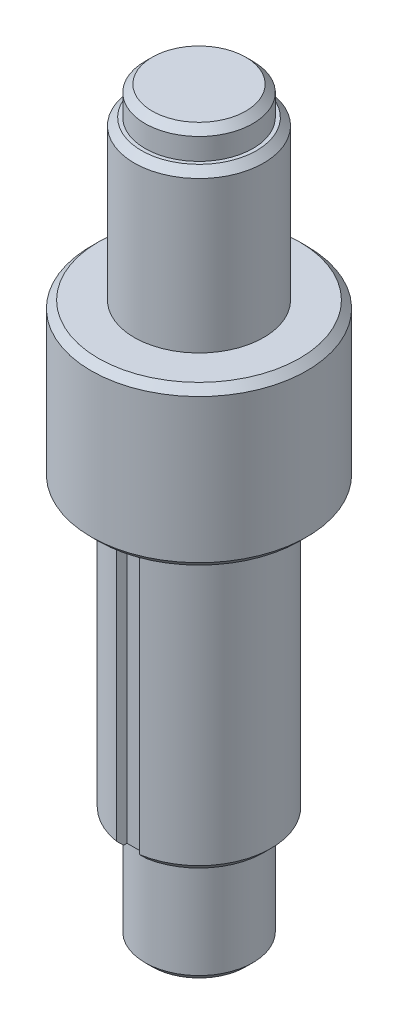
ISO-10303-21;
HEADER;
FILE_DESCRIPTION(('STEP AP214'),'2;1');
FILE_NAME('part.step','',(''),(''),'','','');
FILE_SCHEMA(('AUTOMOTIVE_DESIGN { 1 0 10303 214 1 1 1 1 }'));
ENDSEC;
DATA;
#1=APPLICATION_CONTEXT('core data for automotive mechanical design processes');
#2=APPLICATION_PROTOCOL_DEFINITION('international standard','automotive_design',2000,#1);
#3=PRODUCT_CONTEXT('',#1,'mechanical');
#4=PRODUCT('Part','Part','',(#3));
#5=PRODUCT_RELATED_PRODUCT_CATEGORY('part','',(#4));
#6=PRODUCT_DEFINITION_FORMATION('','',#4);
#7=PRODUCT_DEFINITION_CONTEXT('part definition',#1,'design');
#8=PRODUCT_DEFINITION('design','',#6,#7);
#9=PRODUCT_DEFINITION_SHAPE('','',#8);
#10=(LENGTH_UNIT() NAMED_UNIT(*) SI_UNIT(.MILLI.,.METRE.));
#11=(NAMED_UNIT(*) PLANE_ANGLE_UNIT() SI_UNIT($,.RADIAN.));
#12=(NAMED_UNIT(*) SI_UNIT($,.STERADIAN.) SOLID_ANGLE_UNIT());
#13=UNCERTAINTY_MEASURE_WITH_UNIT(LENGTH_MEASURE(1.E-05),#10,'distance_accuracy_value','');
#14=(GEOMETRIC_REPRESENTATION_CONTEXT(3) GLOBAL_UNCERTAINTY_ASSIGNED_CONTEXT((#13)) GLOBAL_UNIT_ASSIGNED_CONTEXT((#10,
#11,#12)) REPRESENTATION_CONTEXT('',''));
#15=CARTESIAN_POINT('',(0.,0.,0.));
#16=DIRECTION('',(0.,0.,1.));
#17=DIRECTION('',(1.,0.,0.));
#18=AXIS2_PLACEMENT_3D('',#15,#16,#17);
#19=CARTESIAN_POINT('',(0.,0.,0.));
#20=DIRECTION('',(0.,1.,0.));
#21=DIRECTION('',(0.,0.,1.));
#22=AXIS2_PLACEMENT_3D('',#19,#20,#21);
#23=PLANE('',#22);
#24=CARTESIAN_POINT('',(0.,0.,0.));
#25=DIRECTION('',(0.,1.,0.));
#26=DIRECTION('',(0.,0.,1.));
#27=AXIS2_PLACEMENT_3D('',#24,#25,#26);
#28=CIRCLE('',#27,6.49999999999999);
#29=CARTESIAN_POINT('',(0.,0.,6.49999999999999));
#30=VERTEX_POINT('',#29);
#31=EDGE_CURVE('E211',#30,#30,#28,.F.);
#32=ORIENTED_EDGE('',*,*,#31,.T.);
#33=EDGE_LOOP('',(#32));
#34=FACE_BOUND('',#33,.T.);
#35=ADVANCED_FACE('F33',(#34),#23,.F.);
#36=CARTESIAN_POINT('',(0.,103.,0.));
#37=DIRECTION('',(0.,1.,0.));
#38=DIRECTION('',(0.,0.,1.));
#39=AXIS2_PLACEMENT_3D('',#36,#37,#38);
#40=CYLINDRICAL_SURFACE('',#39,7.5);
#41=CARTESIAN_POINT('',(0.,1.00000000000001,0.));
#42=DIRECTION('',(0.,1.,0.));
#43=DIRECTION('',(0.,0.,1.));
#44=AXIS2_PLACEMENT_3D('',#41,#42,#43);
#45=CIRCLE('',#44,7.5);
#46=CARTESIAN_POINT('',(0.,1.00000000000001,7.5));
#47=VERTEX_POINT('',#46);
#48=EDGE_CURVE('E208',#47,#47,#45,.T.);
#49=ORIENTED_EDGE('',*,*,#48,.T.);
#50=EDGE_LOOP('',(#49));
#51=FACE_BOUND('',#50,.T.);
#52=CARTESIAN_POINT('',(0.,15.,0.));
#53=DIRECTION('',(0.,1.,0.));
#54=DIRECTION('',(0.,0.,1.));
#55=AXIS2_PLACEMENT_3D('',#52,#53,#54);
#56=CIRCLE('',#55,7.5);
#57=CARTESIAN_POINT('',(0.,15.,7.5));
#58=VERTEX_POINT('',#57);
#59=EDGE_CURVE('E199',#58,#58,#56,.T.);
#60=ORIENTED_EDGE('',*,*,#59,.F.);
#61=EDGE_LOOP('',(#60));
#62=FACE_BOUND('',#61,.T.);
#63=ADVANCED_FACE('F282',(#51,#62),#40,.T.);
#64=CARTESIAN_POINT('',(7.5,15.,0.));
#65=DIRECTION('',(0.,1.,0.));
#66=DIRECTION('',(0.,0.,1.));
#67=AXIS2_PLACEMENT_3D('',#64,#65,#66);
#68=PLANE('',#67);
#69=DIRECTION('',(0.,0.,-1.));
#70=VECTOR('',#69,1.);
#71=CARTESIAN_POINT('',(-1.625,15.,11.625));
#72=LINE('',#71,#70);
#73=CARTESIAN_POINT('',(-1.625,15.,8.85208308817759));
#74=VERTEX_POINT('',#73);
#75=CARTESIAN_POINT('',(-1.625,15.,8.375));
#76=VERTEX_POINT('',#75);
#77=EDGE_CURVE('E169',#74,#76,#72,.T.);
#78=ORIENTED_EDGE('',*,*,#77,.F.);
#79=CARTESIAN_POINT('',(0.,15.,0.));
#80=DIRECTION('',(0.,1.,0.));
#81=DIRECTION('',(0.,0.,1.));
#82=AXIS2_PLACEMENT_3D('',#79,#80,#81);
#83=CIRCLE('',#82,8.99999999999998);
#84=CARTESIAN_POINT('',(1.625,15.,8.85208308817759));
#85=VERTEX_POINT('',#84);
#86=EDGE_CURVE('E61',#74,#85,#83,.F.);
#87=ORIENTED_EDGE('',*,*,#86,.T.);
#88=DIRECTION('',(0.,0.,1.));
#89=VECTOR('',#88,1.);
#90=CARTESIAN_POINT('',(1.625,15.,11.625));
#91=LINE('',#90,#89);
#92=CARTESIAN_POINT('',(1.625,15.,8.375));
#93=VERTEX_POINT('',#92);
#94=EDGE_CURVE('E164',#93,#85,#91,.T.);
#95=ORIENTED_EDGE('',*,*,#94,.F.);
#96=DIRECTION('',(1.,0.,0.));
#97=VECTOR('',#96,1.);
#98=CARTESIAN_POINT('',(-1.625,15.,8.375));
#99=LINE('',#98,#97);
#100=EDGE_CURVE('E165',#76,#93,#99,.T.);
#101=ORIENTED_EDGE('',*,*,#100,.F.);
#102=EDGE_LOOP('',(#78,#87,#95,#101));
#103=FACE_BOUND('',#102,.T.);
#104=ORIENTED_EDGE('',*,*,#59,.T.);
#105=EDGE_LOOP('',(#104));
#106=FACE_BOUND('',#105,.T.);
#107=ADVANCED_FACE('F278',(#103,#106),#68,.F.);
#108=CARTESIAN_POINT('',(0.,103.,0.));
#109=DIRECTION('',(0.,1.,0.));
#110=DIRECTION('',(0.,0.,1.));
#111=AXIS2_PLACEMENT_3D('',#108,#109,#110);
#112=CYLINDRICAL_SURFACE('',#111,10.);
#113=DIRECTION('',(0.,1.,0.));
#114=VECTOR('',#113,1.);
#115=CARTESIAN_POINT('',(1.625,103.,9.86708543593294));
#116=LINE('',#115,#114);
#117=CARTESIAN_POINT('',(1.625,55.,9.86708543593294));
#118=VERTEX_POINT('',#117);
#119=CARTESIAN_POINT('',(1.625,16.,9.86708543593294));
#120=VERTEX_POINT('',#119);
#121=EDGE_CURVE('E175',#118,#120,#116,.F.);
#122=ORIENTED_EDGE('',*,*,#121,.T.);
#123=CARTESIAN_POINT('',(0.,16.,0.));
#124=DIRECTION('',(0.,1.,0.));
#125=DIRECTION('',(0.,0.,1.));
#126=AXIS2_PLACEMENT_3D('',#123,#124,#125);
#127=CIRCLE('',#126,10.);
#128=CARTESIAN_POINT('',(-1.625,16.,9.86708543593294));
#129=VERTEX_POINT('',#128);
#130=EDGE_CURVE('E230',#120,#129,#127,.T.);
#131=ORIENTED_EDGE('',*,*,#130,.T.);
#132=DIRECTION('',(0.,1.,0.));
#133=VECTOR('',#132,1.);
#134=CARTESIAN_POINT('',(-1.625,103.,9.86708543593294));
#135=LINE('',#134,#133);
#136=CARTESIAN_POINT('',(-1.625,55.,9.86708543593294));
#137=VERTEX_POINT('',#136);
#138=EDGE_CURVE('E187',#129,#137,#135,.T.);
#139=ORIENTED_EDGE('',*,*,#138,.T.);
#140=CARTESIAN_POINT('',(0.,55.,0.));
#141=DIRECTION('',(0.,1.,0.));
#142=DIRECTION('',(0.,0.,1.));
#143=AXIS2_PLACEMENT_3D('',#140,#141,#142);
#144=CIRCLE('',#143,10.);
#145=EDGE_CURVE('E196',#118,#137,#144,.T.);
#146=ORIENTED_EDGE('',*,*,#145,.F.);
#147=EDGE_LOOP('',(#122,#131,#139,#146));
#148=FACE_BOUND('',#147,.T.);
#149=ADVANCED_FACE('F274',(#148),#112,.T.);
#150=CARTESIAN_POINT('',(10.,55.,0.));
#151=DIRECTION('',(0.,1.,0.));
#152=DIRECTION('',(0.,0.,1.));
#153=AXIS2_PLACEMENT_3D('',#150,#151,#152);
#154=PLANE('',#153);
#155=CARTESIAN_POINT('',(0.,55.,0.));
#156=DIRECTION('',(0.,1.,0.));
#157=DIRECTION('',(0.,0.,1.));
#158=AXIS2_PLACEMENT_3D('',#155,#156,#157);
#159=CIRCLE('',#158,14.);
#160=CARTESIAN_POINT('',(0.,55.,14.));
#161=VERTEX_POINT('',#160);
#162=EDGE_CURVE('E223',#161,#161,#159,.F.);
#163=ORIENTED_EDGE('',*,*,#162,.T.);
#164=EDGE_LOOP('',(#163));
#165=FACE_BOUND('',#164,.T.);
#166=ORIENTED_EDGE('',*,*,#145,.T.);
#167=DIRECTION('',(0.,0.,-1.));
#168=VECTOR('',#167,1.);
#169=CARTESIAN_POINT('',(-1.625,55.,11.625));
#170=LINE('',#169,#168);
#171=CARTESIAN_POINT('',(-1.625,55.,8.375));
#172=VERTEX_POINT('',#171);
#173=EDGE_CURVE('E168',#137,#172,#170,.T.);
#174=ORIENTED_EDGE('',*,*,#173,.T.);
#175=DIRECTION('',(1.,0.,0.));
#176=VECTOR('',#175,1.);
#177=CARTESIAN_POINT('',(-1.625,55.,8.375));
#178=LINE('',#177,#176);
#179=CARTESIAN_POINT('',(1.625,55.,8.375));
#180=VERTEX_POINT('',#179);
#181=EDGE_CURVE('E177',#172,#180,#178,.T.);
#182=ORIENTED_EDGE('',*,*,#181,.T.);
#183=DIRECTION('',(0.,0.,1.));
#184=VECTOR('',#183,1.);
#185=CARTESIAN_POINT('',(1.625,55.,11.625));
#186=LINE('',#185,#184);
#187=EDGE_CURVE('E172',#180,#118,#186,.T.);
#188=ORIENTED_EDGE('',*,*,#187,.T.);
#189=EDGE_LOOP('',(#166,#174,#182,#188));
#190=FACE_BOUND('',#189,.T.);
#191=ADVANCED_FACE('F270',(#165,#190),#154,.F.);
#192=CARTESIAN_POINT('',(0.,103.,0.));
#193=DIRECTION('',(0.,1.,0.));
#194=DIRECTION('',(0.,0.,1.));
#195=AXIS2_PLACEMENT_3D('',#192,#193,#194);
#196=CYLINDRICAL_SURFACE('',#195,15.);
#197=CARTESIAN_POINT('',(0.,76.,0.));
#198=DIRECTION('',(0.,-1.,0.));
#199=DIRECTION('',(0.,0.,-1.));
#200=AXIS2_PLACEMENT_3D('',#197,#198,#199);
#201=CIRCLE('',#200,15.);
#202=CARTESIAN_POINT('',(0.,76.,-15.));
#203=VERTEX_POINT('',#202);
#204=EDGE_CURVE('E220',#203,#203,#201,.T.);
#205=ORIENTED_EDGE('',*,*,#204,.T.);
#206=EDGE_LOOP('',(#205));
#207=FACE_BOUND('',#206,.T.);
#208=CARTESIAN_POINT('',(0.,56.,0.));
#209=DIRECTION('',(0.,1.,0.));
#210=DIRECTION('',(0.,0.,1.));
#211=AXIS2_PLACEMENT_3D('',#208,#209,#210);
#212=CIRCLE('',#211,15.);
#213=CARTESIAN_POINT('',(0.,56.,15.));
#214=VERTEX_POINT('',#213);
#215=EDGE_CURVE('E217',#214,#214,#212,.T.);
#216=ORIENTED_EDGE('',*,*,#215,.T.);
#217=EDGE_LOOP('',(#216));
#218=FACE_BOUND('',#217,.T.);
#219=ADVANCED_FACE('F266',(#207,#218),#196,.T.);
#220=CARTESIAN_POINT('',(15.,77.,0.));
#221=DIRECTION('',(0.,-1.,0.));
#222=DIRECTION('',(0.,0.,-1.));
#223=AXIS2_PLACEMENT_3D('',#220,#221,#222);
#224=PLANE('',#223);
#225=CARTESIAN_POINT('',(0.,77.,0.));
#226=DIRECTION('',(0.,-1.,0.));
#227=DIRECTION('',(0.,0.,-1.));
#228=AXIS2_PLACEMENT_3D('',#225,#226,#227);
#229=CIRCLE('',#228,14.);
#230=CARTESIAN_POINT('',(0.,77.,-14.));
#231=VERTEX_POINT('',#230);
#232=EDGE_CURVE('E214',#231,#231,#229,.F.);
#233=ORIENTED_EDGE('',*,*,#232,.T.);
#234=EDGE_LOOP('',(#233));
#235=FACE_BOUND('',#234,.T.);
#236=CARTESIAN_POINT('',(0.,77.,0.));
#237=DIRECTION('',(0.,1.,0.));
#238=DIRECTION('',(0.,0.,1.));
#239=AXIS2_PLACEMENT_3D('',#236,#237,#238);
#240=CIRCLE('',#239,9.);
#241=CARTESIAN_POINT('',(-1.625,77.,-8.85208308817761));
#242=VERTEX_POINT('',#241);
#243=CARTESIAN_POINT('',(1.625,77.,-8.85208308817761));
#244=VERTEX_POINT('',#243);
#245=EDGE_CURVE('E193',#242,#244,#240,.T.);
#246=ORIENTED_EDGE('',*,*,#245,.F.);
#247=DIRECTION('',(0.,0.,1.));
#248=VECTOR('',#247,1.);
#249=CARTESIAN_POINT('',(-1.625,77.,-10.625));
#250=LINE('',#249,#248);
#251=CARTESIAN_POINT('',(-1.625,77.,-7.375));
#252=VERTEX_POINT('',#251);
#253=EDGE_CURVE('E156',#242,#252,#250,.T.);
#254=ORIENTED_EDGE('',*,*,#253,.T.);
#255=DIRECTION('',(1.,0.,0.));
#256=VECTOR('',#255,1.);
#257=CARTESIAN_POINT('',(-1.625,77.,-7.375));
#258=LINE('',#257,#256);
#259=CARTESIAN_POINT('',(1.625,77.,-7.375));
#260=VERTEX_POINT('',#259);
#261=EDGE_CURVE('E141',#252,#260,#258,.T.);
#262=ORIENTED_EDGE('',*,*,#261,.T.);
#263=DIRECTION('',(0.,0.,-1.));
#264=VECTOR('',#263,1.);
#265=CARTESIAN_POINT('',(1.625,77.,-10.625));
#266=LINE('',#265,#264);
#267=EDGE_CURVE('E140',#260,#244,#266,.T.);
#268=ORIENTED_EDGE('',*,*,#267,.T.);
#269=EDGE_LOOP('',(#246,#254,#262,#268));
#270=FACE_BOUND('',#269,.T.);
#271=ADVANCED_FACE('F262',(#235,#270),#224,.F.);
#272=CARTESIAN_POINT('',(0.,103.,0.));
#273=DIRECTION('',(0.,1.,0.));
#274=DIRECTION('',(0.,0.,1.));
#275=AXIS2_PLACEMENT_3D('',#272,#273,#274);
#276=CYLINDRICAL_SURFACE('',#275,9.);
#277=CARTESIAN_POINT('',(0.,98.,0.));
#278=DIRECTION('',(0.,-1.,0.));
#279=DIRECTION('',(0.,0.,-1.));
#280=AXIS2_PLACEMENT_3D('',#277,#278,#279);
#281=CIRCLE('',#280,9.);
#282=CARTESIAN_POINT('',(1.625,98.,-8.85208308817761));
#283=VERTEX_POINT('',#282);
#284=CARTESIAN_POINT('',(-1.625,98.,-8.85208308817761));
#285=VERTEX_POINT('',#284);
#286=EDGE_CURVE('E227',#283,#285,#281,.T.);
#287=ORIENTED_EDGE('',*,*,#286,.T.);
#288=DIRECTION('',(0.,1.,0.));
#289=VECTOR('',#288,1.);
#290=CARTESIAN_POINT('',(-1.625,103.,-8.85208308817761));
#291=LINE('',#290,#289);
#292=EDGE_CURVE('E161',#285,#242,#291,.F.);
#293=ORIENTED_EDGE('',*,*,#292,.T.);
#294=ORIENTED_EDGE('',*,*,#245,.T.);
#295=DIRECTION('',(0.,1.,0.));
#296=VECTOR('',#295,1.);
#297=CARTESIAN_POINT('',(1.625,103.,-8.85208308817761));
#298=LINE('',#297,#296);
#299=EDGE_CURVE('E153',#244,#283,#298,.T.);
#300=ORIENTED_EDGE('',*,*,#299,.T.);
#301=EDGE_LOOP('',(#287,#293,#294,#300));
#302=FACE_BOUND('',#301,.T.);
#303=ADVANCED_FACE('F259',(#302),#276,.T.);
#304=CARTESIAN_POINT('',(9.,99.,0.));
#305=DIRECTION('',(0.,-1.,0.));
#306=DIRECTION('',(0.,0.,-1.));
#307=AXIS2_PLACEMENT_3D('',#304,#305,#306);
#308=PLANE('',#307);
#309=DIRECTION('',(1.,0.,0.));
#310=VECTOR('',#309,1.);
#311=CARTESIAN_POINT('',(-1.625,99.,-7.375));
#312=LINE('',#311,#310);
#313=CARTESIAN_POINT('',(-1.625,99.,-7.375));
#314=VERTEX_POINT('',#313);
#315=CARTESIAN_POINT('',(-1.36358901432944,99.,-7.375));
#316=VERTEX_POINT('',#315);
#317=EDGE_CURVE('E137',#314,#316,#312,.T.);
#318=ORIENTED_EDGE('',*,*,#317,.F.);
#319=DIRECTION('',(0.,0.,1.));
#320=VECTOR('',#319,1.);
#321=CARTESIAN_POINT('',(-1.625,99.,-10.625));
#322=LINE('',#321,#320);
#323=CARTESIAN_POINT('',(-1.625,99.,-7.83322251694663));
#324=VERTEX_POINT('',#323);
#325=EDGE_CURVE('E135',#324,#314,#322,.T.);
#326=ORIENTED_EDGE('',*,*,#325,.F.);
#327=CARTESIAN_POINT('',(0.,99.,0.));
#328=DIRECTION('',(0.,-1.,0.));
#329=DIRECTION('',(0.,0.,-1.));
#330=AXIS2_PLACEMENT_3D('',#327,#328,#329);
#331=CIRCLE('',#330,7.99999999999998);
#332=CARTESIAN_POINT('',(1.625,99.,-7.83322251694663));
#333=VERTEX_POINT('',#332);
#334=EDGE_CURVE('E148',#324,#333,#331,.F.);
#335=ORIENTED_EDGE('',*,*,#334,.T.);
#336=DIRECTION('',(0.,0.,-1.));
#337=VECTOR('',#336,1.);
#338=CARTESIAN_POINT('',(1.625,99.,-10.625));
#339=LINE('',#338,#337);
#340=CARTESIAN_POINT('',(1.625,99.,-7.375));
#341=VERTEX_POINT('',#340);
#342=EDGE_CURVE('E53',#341,#333,#339,.T.);
#343=ORIENTED_EDGE('',*,*,#342,.F.);
#344=CARTESIAN_POINT('',(1.36358901432944,99.,-7.375));
#345=VERTEX_POINT('',#344);
#346=EDGE_CURVE('E124',#345,#341,#312,.T.);
#347=ORIENTED_EDGE('',*,*,#346,.F.);
#348=CARTESIAN_POINT('',(0.,99.,0.));
#349=DIRECTION('',(0.,1.,0.));
#350=DIRECTION('',(0.,0.,1.));
#351=AXIS2_PLACEMENT_3D('',#348,#349,#350);
#352=CIRCLE('',#351,7.5);
#353=EDGE_CURVE('E189',#316,#345,#352,.T.);
#354=ORIENTED_EDGE('',*,*,#353,.F.);
#355=EDGE_LOOP('',(#318,#326,#335,#343,#347,#354));
#356=FACE_BOUND('',#355,.T.);
#357=ADVANCED_FACE('F145',(#356),#308,.F.);
#358=CARTESIAN_POINT('',(0.,103.,0.));
#359=DIRECTION('',(0.,1.,0.));
#360=DIRECTION('',(0.,0.,1.));
#361=AXIS2_PLACEMENT_3D('',#358,#359,#360);
#362=CYLINDRICAL_SURFACE('',#361,7.5);
#363=CARTESIAN_POINT('',(0.,102.,0.));
#364=DIRECTION('',(0.,-1.,0.));
#365=DIRECTION('',(0.,0.,-1.));
#366=AXIS2_PLACEMENT_3D('',#363,#364,#365);
#367=CIRCLE('',#366,7.5);
#368=CARTESIAN_POINT('',(0.,102.,-7.5));
#369=VERTEX_POINT('',#368);
#370=EDGE_CURVE('E205',#369,#369,#367,.T.);
#371=ORIENTED_EDGE('',*,*,#370,.T.);
#372=EDGE_LOOP('',(#371));
#373=FACE_BOUND('',#372,.T.);
#374=EDGE_CURVE('E190',#345,#316,#352,.T.);
#375=ORIENTED_EDGE('',*,*,#374,.T.);
#376=ORIENTED_EDGE('',*,*,#353,.T.);
#377=EDGE_LOOP('',(#375,#376));
#378=FACE_BOUND('',#377,.T.);
#379=ADVANCED_FACE('F252',(#373,#378),#362,.T.);
#380=CARTESIAN_POINT('',(7.5,103.,0.));
#381=DIRECTION('',(0.,-1.,0.));
#382=DIRECTION('',(0.,0.,-1.));
#383=AXIS2_PLACEMENT_3D('',#380,#381,#382);
#384=PLANE('',#383);
#385=CARTESIAN_POINT('',(0.,103.,0.));
#386=DIRECTION('',(0.,-1.,0.));
#387=DIRECTION('',(0.,0.,-1.));
#388=AXIS2_PLACEMENT_3D('',#385,#386,#387);
#389=CIRCLE('',#388,6.49999999999999);
#390=CARTESIAN_POINT('',(0.,103.,-6.49999999999999));
#391=VERTEX_POINT('',#390);
#392=EDGE_CURVE('E202',#391,#391,#389,.F.);
#393=ORIENTED_EDGE('',*,*,#392,.T.);
#394=EDGE_LOOP('',(#393));
#395=FACE_BOUND('',#394,.T.);
#396=ADVANCED_FACE('F246',(#395),#384,.F.);
#397=CARTESIAN_POINT('',(-1.625,59.5961940777126,11.625));
#398=DIRECTION('',(-1.,0.,0.));
#399=DIRECTION('',(0.,0.,1.));
#400=AXIS2_PLACEMENT_3D('',#397,#398,#399);
#401=PLANE('',#400);
#402=ORIENTED_EDGE('',*,*,#138,.F.);
#403=CARTESIAN_POINT('',(-1.625,16.,9.86708543593294));
#404=CARTESIAN_POINT('',(-1.625,15.8331987737948,9.69805095141648));
#405=CARTESIAN_POINT('',(-1.625,15.6664648280521,9.52895018088338));
#406=CARTESIAN_POINT('',(-1.625,15.3331314947165,9.19061606496714));
#407=CARTESIAN_POINT('',(-1.625,15.1665321071259,9.02138271958178));
#408=CARTESIAN_POINT('',(-1.625,15.,8.85208308817759));
#409=B_SPLINE_CURVE_WITH_KNOTS('',3,(#403,#404,#405,#406,#407,#408),.UNSPECIFIED.,.F.,.F.,(4,2,
4),(0.,0.712430707732589,1.42486142732788),.UNSPECIFIED.);
#410=EDGE_CURVE('E233',#129,#74,#409,.T.);
#411=ORIENTED_EDGE('',*,*,#410,.T.);
#412=ORIENTED_EDGE('',*,*,#77,.T.);
#413=DIRECTION('',(0.,-1.,0.));
#414=VECTOR('',#413,1.);
#415=CARTESIAN_POINT('',(-1.625,59.5961940777126,8.375));
#416=LINE('',#415,#414);
#417=EDGE_CURVE('E180',#172,#76,#416,.T.);
#418=ORIENTED_EDGE('',*,*,#417,.F.);
#419=ORIENTED_EDGE('',*,*,#173,.F.);
#420=EDGE_LOOP('',(#402,#411,#412,#418,#419));
#421=FACE_BOUND('',#420,.T.);
#422=ADVANCED_FACE('F240',(#421),#401,.F.);
#423=CARTESIAN_POINT('',(1.625,59.5961940777126,11.625));
#424=DIRECTION('',(1.,0.,0.));
#425=DIRECTION('',(0.,0.,-1.));
#426=AXIS2_PLACEMENT_3D('',#423,#424,#425);
#427=PLANE('',#426);
#428=ORIENTED_EDGE('',*,*,#94,.T.);
#429=CARTESIAN_POINT('',(1.625,15.,8.85208308817759));
#430=CARTESIAN_POINT('',(1.625,15.1665321071259,9.02138271958178));
#431=CARTESIAN_POINT('',(1.625,15.3331314947165,9.19061606496714));
#432=CARTESIAN_POINT('',(1.625,15.6664648280521,9.52895018088338));
#433=CARTESIAN_POINT('',(1.625,15.8331987737948,9.69805095141648));
#434=CARTESIAN_POINT('',(1.625,16.,9.86708543593294));
#435=B_SPLINE_CURVE_WITH_KNOTS('',3,(#429,#430,#431,#432,#433,#434),.UNSPECIFIED.,.F.,.F.,(4,2,
4),(0.,0.712430719595286,1.42486142732788),.UNSPECIFIED.);
#436=EDGE_CURVE('E313',#85,#120,#435,.T.);
#437=ORIENTED_EDGE('',*,*,#436,.T.);
#438=ORIENTED_EDGE('',*,*,#121,.F.);
#439=ORIENTED_EDGE('',*,*,#187,.F.);
#440=DIRECTION('',(0.,-1.,0.));
#441=VECTOR('',#440,1.);
#442=CARTESIAN_POINT('',(1.625,59.5961940777126,8.375));
#443=LINE('',#442,#441);
#444=EDGE_CURVE('E176',#180,#93,#443,.T.);
#445=ORIENTED_EDGE('',*,*,#444,.T.);
#446=EDGE_LOOP('',(#428,#437,#438,#439,#445));
#447=FACE_BOUND('',#446,.T.);
#448=ADVANCED_FACE('F245',(#447),#427,.F.);
#449=CARTESIAN_POINT('',(-1.625,59.5961940777126,8.375));
#450=DIRECTION('',(0.,0.,-1.));
#451=DIRECTION('',(-1.,0.,0.));
#452=AXIS2_PLACEMENT_3D('',#449,#450,#451);
#453=PLANE('',#452);
#454=ORIENTED_EDGE('',*,*,#417,.T.);
#455=ORIENTED_EDGE('',*,*,#100,.T.);
#456=ORIENTED_EDGE('',*,*,#444,.F.);
#457=ORIENTED_EDGE('',*,*,#181,.F.);
#458=EDGE_LOOP('',(#454,#455,#456,#457));
#459=FACE_BOUND('',#458,.T.);
#460=ADVANCED_FACE('F248',(#459),#453,.F.);
#461=CARTESIAN_POINT('',(0.,103.,0.));
#462=DIRECTION('',(0.,-1.,0.));
#463=DIRECTION('',(0.,0.,-1.));
#464=AXIS2_PLACEMENT_3D('',#461,#462,#463);
#465=CONICAL_SURFACE('',#464,6.49999999999999,0.785398163397445);
#466=ORIENTED_EDGE('',*,*,#370,.F.);
#467=EDGE_LOOP('',(#466));
#468=FACE_BOUND('',#467,.T.);
#469=ORIENTED_EDGE('',*,*,#392,.F.);
#470=EDGE_LOOP('',(#469));
#471=FACE_BOUND('',#470,.T.);
#472=ADVANCED_FACE('F289',(#468,#471),#465,.T.);
#473=CARTESIAN_POINT('',(0.,1.00000000000001,0.));
#474=DIRECTION('',(0.,1.,0.));
#475=DIRECTION('',(0.,0.,1.));
#476=AXIS2_PLACEMENT_3D('',#473,#474,#475);
#477=CONICAL_SURFACE('',#476,7.5,0.785398163397445);
#478=ORIENTED_EDGE('',*,*,#31,.F.);
#479=EDGE_LOOP('',(#478));
#480=FACE_BOUND('',#479,.T.);
#481=ORIENTED_EDGE('',*,*,#48,.F.);
#482=EDGE_LOOP('',(#481));
#483=FACE_BOUND('',#482,.T.);
#484=ADVANCED_FACE('F292',(#480,#483),#477,.T.);
#485=CARTESIAN_POINT('',(0.,77.,0.));
#486=DIRECTION('',(0.,-1.,0.));
#487=DIRECTION('',(0.,0.,-1.));
#488=AXIS2_PLACEMENT_3D('',#485,#486,#487);
#489=CONICAL_SURFACE('',#488,14.,0.785398163397444);
#490=ORIENTED_EDGE('',*,*,#204,.F.);
#491=EDGE_LOOP('',(#490));
#492=FACE_BOUND('',#491,.T.);
#493=ORIENTED_EDGE('',*,*,#232,.F.);
#494=EDGE_LOOP('',(#493));
#495=FACE_BOUND('',#494,.T.);
#496=ADVANCED_FACE('F296',(#492,#495),#489,.T.);
#497=CARTESIAN_POINT('',(0.,56.,0.));
#498=DIRECTION('',(0.,1.,0.));
#499=DIRECTION('',(0.,0.,1.));
#500=AXIS2_PLACEMENT_3D('',#497,#498,#499);
#501=CONICAL_SURFACE('',#500,15.,0.785398163397455);
#502=ORIENTED_EDGE('',*,*,#162,.F.);
#503=EDGE_LOOP('',(#502));
#504=FACE_BOUND('',#503,.T.);
#505=ORIENTED_EDGE('',*,*,#215,.F.);
#506=EDGE_LOOP('',(#505));
#507=FACE_BOUND('',#506,.T.);
#508=ADVANCED_FACE('F300',(#504,#507),#501,.T.);
#509=CARTESIAN_POINT('',(0.,99.,0.));
#510=DIRECTION('',(0.,-1.,0.));
#511=DIRECTION('',(0.,0.,-1.));
#512=AXIS2_PLACEMENT_3D('',#509,#510,#511);
#513=CONICAL_SURFACE('',#512,7.99999999999998,0.785398163397445);
#514=CARTESIAN_POINT('',(-1.625,95.5367620013898,-11.3474755083578));
#515=CARTESIAN_POINT('',(-1.625,95.973028490968,-10.9067008366484));
#516=CARTESIAN_POINT('',(-1.625,96.4090909339114,-10.4657227931871));
#517=CARTESIAN_POINT('',(-1.625,97.2804530012763,-9.58302094821458));
#518=CARTESIAN_POINT('',(-1.625,97.7157526318521,-9.1412971527768));
#519=CARTESIAN_POINT('',(-1.625,98.3678708142734,-8.47789092046407));
#520=CARTESIAN_POINT('',(-1.625,98.5851057867356,-8.25661794657441));
#521=CARTESIAN_POINT('',(-1.625,99.0192161780505,-7.81371989164268));
#522=CARTESIAN_POINT('',(-1.625,99.2360915972019,-7.59209481089327));
#523=CARTESIAN_POINT('',(-1.625,99.669387090065,-7.14839614636371));
#524=CARTESIAN_POINT('',(-1.625,99.885807160049,-6.92632255894066));
#525=CARTESIAN_POINT('',(-1.625,100.318028303471,-6.48157272397845));
#526=CARTESIAN_POINT('',(-1.625,100.533829375122,-6.25889647470399));
#527=CARTESIAN_POINT('',(-1.625,100.749239384656,-6.0358415544423));
#528=B_SPLINE_CURVE_WITH_KNOTS('',3,(#514,#515,#516,#517,#518,#519,#520,#521,#522,#523,#524,
#525,#526,#527),.UNSPECIFIED.,.F.,.F.,(4,2,2,2,2,2,4),(0.,1.86051139735318,3.72100771495597,
4.65126264323236,5.58151679868635,6.51177854055996,7.44204296388434),.UNSPECIFIED.);
#529=EDGE_CURVE('E11',#285,#324,#528,.T.);
#530=ORIENTED_EDGE('',*,*,#529,.F.);
#531=ORIENTED_EDGE('',*,*,#286,.F.);
#532=CARTESIAN_POINT('',(1.625,100.749239384656,-6.0358415544423));
#533=CARTESIAN_POINT('',(1.625,100.533829375122,-6.25889647470399));
#534=CARTESIAN_POINT('',(1.625,100.318028303471,-6.48157272397845));
#535=CARTESIAN_POINT('',(1.625,99.885807160049,-6.92632255894066));
#536=CARTESIAN_POINT('',(1.625,99.6693870900651,-7.14839614636371));
#537=CARTESIAN_POINT('',(1.625,99.2360915972019,-7.59209481089326));
#538=CARTESIAN_POINT('',(1.625,99.0192161780506,-7.81371989164267));
#539=CARTESIAN_POINT('',(1.625,98.5851057867356,-8.25661794657441));
#540=CARTESIAN_POINT('',(1.625,98.3678708142734,-8.47789092046407));
#541=CARTESIAN_POINT('',(1.625,97.7157526318521,-9.14129715277679));
#542=CARTESIAN_POINT('',(1.625,97.2804530012763,-9.58302094821458));
#543=CARTESIAN_POINT('',(1.625,96.4090909339114,-10.4657227931871));
#544=CARTESIAN_POINT('',(1.625,95.973028490968,-10.9067008366484));
#545=CARTESIAN_POINT('',(1.625,95.5367620013898,-11.3474755083578));
#546=B_SPLINE_CURVE_WITH_KNOTS('',3,(#532,#533,#534,#535,#536,#537,#538,#539,#540,#541,#542,
#543,#544,#545),.UNSPECIFIED.,.F.,.F.,(4,2,2,2,2,2,4),(0.,0.930264423324364,1.86052616519797,
2.79078032065196,3.72103524892837,5.58153156653114,7.44204296388434),.UNSPECIFIED.);
#547=EDGE_CURVE('E46',#333,#283,#546,.T.);
#548=ORIENTED_EDGE('',*,*,#547,.F.);
#549=ORIENTED_EDGE('',*,*,#334,.F.);
#550=EDGE_LOOP('',(#530,#531,#548,#549));
#551=FACE_BOUND('',#550,.T.);
#552=ADVANCED_FACE('F303',(#551),#513,.T.);
#553=CARTESIAN_POINT('',(0.,16.,0.));
#554=DIRECTION('',(0.,1.,0.));
#555=DIRECTION('',(0.,0.,1.));
#556=AXIS2_PLACEMENT_3D('',#553,#554,#555);
#557=CONICAL_SURFACE('',#556,10.,0.785398163397443);
#558=ORIENTED_EDGE('',*,*,#436,.F.);
#559=ORIENTED_EDGE('',*,*,#86,.F.);
#560=ORIENTED_EDGE('',*,*,#410,.F.);
#561=ORIENTED_EDGE('',*,*,#130,.F.);
#562=EDGE_LOOP('',(#558,#559,#560,#561));
#563=FACE_BOUND('',#562,.T.);
#564=ADVANCED_FACE('F35',(#563),#557,.T.);
#565=CARTESIAN_POINT('',(0.,99.,0.));
#566=DIRECTION('',(0.,1.,0.));
#567=DIRECTION('',(0.,0.,1.));
#568=AXIS2_PLACEMENT_3D('',#565,#566,#567);
#569=PLANE('',#568);
#570=EDGE_CURVE('E131',#316,#345,#312,.T.);
#571=ORIENTED_EDGE('',*,*,#570,.F.);
#572=ORIENTED_EDGE('',*,*,#374,.F.);
#573=EDGE_LOOP('',(#571,#572));
#574=FACE_BOUND('',#573,.T.);
#575=ADVANCED_FACE('F322',(#574),#569,.F.);
#576=CARTESIAN_POINT('',(-1.625,72.4038059222875,-10.625));
#577=DIRECTION('',(-1.,0.,0.));
#578=DIRECTION('',(0.,0.,1.));
#579=AXIS2_PLACEMENT_3D('',#576,#577,#578);
#580=PLANE('',#579);
#581=ORIENTED_EDGE('',*,*,#529,.T.);
#582=ORIENTED_EDGE('',*,*,#325,.T.);
#583=DIRECTION('',(0.,1.,0.));
#584=VECTOR('',#583,1.);
#585=CARTESIAN_POINT('',(-1.625,72.4038059222875,-7.375));
#586=LINE('',#585,#584);
#587=EDGE_CURVE('E155',#252,#314,#586,.T.);
#588=ORIENTED_EDGE('',*,*,#587,.F.);
#589=ORIENTED_EDGE('',*,*,#253,.F.);
#590=ORIENTED_EDGE('',*,*,#292,.F.);
#591=EDGE_LOOP('',(#581,#582,#588,#589,#590));
#592=FACE_BOUND('',#591,.T.);
#593=ADVANCED_FACE('F321',(#592),#580,.F.);
#594=CARTESIAN_POINT('',(1.625,72.4038059222875,-10.625));
#595=DIRECTION('',(1.,0.,0.));
#596=DIRECTION('',(0.,0.,-1.));
#597=AXIS2_PLACEMENT_3D('',#594,#595,#596);
#598=PLANE('',#597);
#599=ORIENTED_EDGE('',*,*,#267,.F.);
#600=DIRECTION('',(0.,1.,0.));
#601=VECTOR('',#600,1.);
#602=CARTESIAN_POINT('',(1.625,72.4038059222875,-7.375));
#603=LINE('',#602,#601);
#604=EDGE_CURVE('E128',#260,#341,#603,.T.);
#605=ORIENTED_EDGE('',*,*,#604,.T.);
#606=ORIENTED_EDGE('',*,*,#342,.T.);
#607=ORIENTED_EDGE('',*,*,#547,.T.);
#608=ORIENTED_EDGE('',*,*,#299,.F.);
#609=EDGE_LOOP('',(#599,#605,#606,#607,#608));
#610=FACE_BOUND('',#609,.T.);
#611=ADVANCED_FACE('F138',(#610),#598,.F.);
#612=CARTESIAN_POINT('',(-1.625,72.4038059222875,-7.375));
#613=DIRECTION('',(0.,0.,1.));
#614=DIRECTION('',(1.,0.,0.));
#615=AXIS2_PLACEMENT_3D('',#612,#613,#614);
#616=PLANE('',#615);
#617=ORIENTED_EDGE('',*,*,#587,.T.);
#618=ORIENTED_EDGE('',*,*,#317,.T.);
#619=ORIENTED_EDGE('',*,*,#570,.T.);
#620=ORIENTED_EDGE('',*,*,#346,.T.);
#621=ORIENTED_EDGE('',*,*,#604,.F.);
#622=ORIENTED_EDGE('',*,*,#261,.F.);
#623=EDGE_LOOP('',(#617,#618,#619,#620,#621,#622));
#624=FACE_BOUND('',#623,.T.);
#625=ADVANCED_FACE('F126',(#624),#616,.F.);
#626=CLOSED_SHELL('',(#35,#63,#107,#149,#191,#219,#271,#303,#357,#379,#396,#422,#448,#460,#472,
#484,#496,#508,#552,#564,#575,#593,#611,#625));
#627=MANIFOLD_SOLID_BREP('B2',#626);
#628=ADVANCED_BREP_SHAPE_REPRESENTATION('',(#18,#627),#14);
#629=SHAPE_DEFINITION_REPRESENTATION(#9,#628);
ENDSEC;
END-ISO-10303-21;
